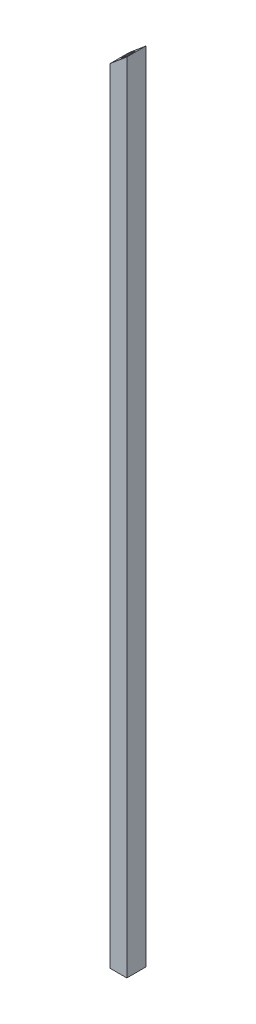
ISO-10303-21;
HEADER;
FILE_DESCRIPTION(('STEP AP214'),'2;1');
FILE_NAME('part.step','',(''),(''),'','','');
FILE_SCHEMA(('AUTOMOTIVE_DESIGN { 1 0 10303 214 1 1 1 1 }'));
ENDSEC;
DATA;
#1=APPLICATION_CONTEXT('core data for automotive mechanical design processes');
#2=APPLICATION_PROTOCOL_DEFINITION('international standard','automotive_design',2000,#1);
#3=PRODUCT_CONTEXT('',#1,'mechanical');
#4=PRODUCT('Part','Part','',(#3));
#5=PRODUCT_RELATED_PRODUCT_CATEGORY('part','',(#4));
#6=PRODUCT_DEFINITION_FORMATION('','',#4);
#7=PRODUCT_DEFINITION_CONTEXT('part definition',#1,'design');
#8=PRODUCT_DEFINITION('design','',#6,#7);
#9=PRODUCT_DEFINITION_SHAPE('','',#8);
#10=(LENGTH_UNIT() NAMED_UNIT(*) SI_UNIT(.MILLI.,.METRE.));
#11=(NAMED_UNIT(*) PLANE_ANGLE_UNIT() SI_UNIT($,.RADIAN.));
#12=(NAMED_UNIT(*) SI_UNIT($,.STERADIAN.) SOLID_ANGLE_UNIT());
#13=UNCERTAINTY_MEASURE_WITH_UNIT(LENGTH_MEASURE(1.E-05),#10,'distance_accuracy_value','');
#14=(GEOMETRIC_REPRESENTATION_CONTEXT(3) GLOBAL_UNCERTAINTY_ASSIGNED_CONTEXT((#13)) GLOBAL_UNIT_ASSIGNED_CONTEXT((#10,
#11,#12)) REPRESENTATION_CONTEXT('',''));
#15=CARTESIAN_POINT('',(0.,0.,0.));
#16=DIRECTION('',(0.,0.,1.));
#17=DIRECTION('',(1.,0.,0.));
#18=AXIS2_PLACEMENT_3D('',#15,#16,#17);
#19=CARTESIAN_POINT('',(11.1125,-533.4,12.7));
#20=DIRECTION('',(-1.,0.,0.));
#21=DIRECTION('',(0.,0.,1.));
#22=AXIS2_PLACEMENT_3D('',#19,#20,#21);
#23=PLANE('',#22);
#24=DIRECTION('',(0.,1.,0.));
#25=VECTOR('',#24,1.);
#26=CARTESIAN_POINT('',(11.1125,-533.4,-12.7));
#27=LINE('',#26,#25);
#28=CARTESIAN_POINT('',(11.1125,-533.4,-12.7));
#29=VERTEX_POINT('',#28);
#30=CARTESIAN_POINT('',(11.1125,533.4,-12.7));
#31=VERTEX_POINT('',#30);
#32=EDGE_CURVE('E119',#29,#31,#27,.T.);
#33=ORIENTED_EDGE('',*,*,#32,.T.);
#34=DIRECTION('',(0.,0.,-1.));
#35=VECTOR('',#34,1.);
#36=CARTESIAN_POINT('',(11.1125,533.4,12.7));
#37=LINE('',#36,#35);
#38=CARTESIAN_POINT('',(11.1125,533.4,12.7));
#39=VERTEX_POINT('',#38);
#40=EDGE_CURVE('E40',#39,#31,#37,.T.);
#41=ORIENTED_EDGE('',*,*,#40,.F.);
#42=DIRECTION('',(0.,1.,0.));
#43=VECTOR('',#42,1.);
#44=CARTESIAN_POINT('',(11.1125,-533.4,12.7));
#45=LINE('',#44,#43);
#46=CARTESIAN_POINT('',(11.1125,-533.4,12.7));
#47=VERTEX_POINT('',#46);
#48=EDGE_CURVE('E121',#47,#39,#45,.T.);
#49=ORIENTED_EDGE('',*,*,#48,.F.);
#50=DIRECTION('',(0.,0.,-1.));
#51=VECTOR('',#50,1.);
#52=CARTESIAN_POINT('',(11.1125,-533.4,12.7));
#53=LINE('',#52,#51);
#54=EDGE_CURVE('E127',#47,#29,#53,.T.);
#55=ORIENTED_EDGE('',*,*,#54,.T.);
#56=EDGE_LOOP('',(#33,#41,#49,#55));
#57=FACE_BOUND('',#56,.T.);
#58=ADVANCED_FACE('F33',(#57),#23,.F.);
#59=CARTESIAN_POINT('',(-11.1125,-533.4,12.7));
#60=DIRECTION('',(1.,0.,0.));
#61=DIRECTION('',(0.,0.,-1.));
#62=AXIS2_PLACEMENT_3D('',#59,#60,#61);
#63=PLANE('',#62);
#64=DIRECTION('',(0.,-1.,0.));
#65=VECTOR('',#64,1.);
#66=CARTESIAN_POINT('',(-11.1125,-533.4,12.7));
#67=LINE('',#66,#65);
#68=CARTESIAN_POINT('',(-11.1125,514.751010697085,12.7));
#69=VERTEX_POINT('',#68);
#70=CARTESIAN_POINT('',(-11.1125,-533.4,12.7));
#71=VERTEX_POINT('',#70);
#72=EDGE_CURVE('E114',#69,#71,#67,.T.);
#73=ORIENTED_EDGE('',*,*,#72,.F.);
#74=DIRECTION('',(0.,0.,1.));
#75=VECTOR('',#74,1.);
#76=CARTESIAN_POINT('',(-11.1125,514.751010697085,-12.7));
#77=LINE('',#76,#75);
#78=CARTESIAN_POINT('',(-11.1125,514.751010697085,-12.7));
#79=VERTEX_POINT('',#78);
#80=EDGE_CURVE('E99',#79,#69,#77,.T.);
#81=ORIENTED_EDGE('',*,*,#80,.F.);
#82=DIRECTION('',(0.,-1.,0.));
#83=VECTOR('',#82,1.);
#84=CARTESIAN_POINT('',(-11.1125,-533.4,-12.7));
#85=LINE('',#84,#83);
#86=CARTESIAN_POINT('',(-11.1125,-533.4,-12.7));
#87=VERTEX_POINT('',#86);
#88=EDGE_CURVE('E112',#79,#87,#85,.T.);
#89=ORIENTED_EDGE('',*,*,#88,.T.);
#90=DIRECTION('',(0.,0.,-1.));
#91=VECTOR('',#90,1.);
#92=CARTESIAN_POINT('',(-11.1125,-533.4,12.7));
#93=LINE('',#92,#91);
#94=EDGE_CURVE('E130',#71,#87,#93,.T.);
#95=ORIENTED_EDGE('',*,*,#94,.F.);
#96=EDGE_LOOP('',(#73,#81,#89,#95));
#97=FACE_BOUND('',#96,.T.);
#98=ADVANCED_FACE('F110',(#97),#63,.F.);
#99=CARTESIAN_POINT('',(-11.1125,-533.4,12.7));
#100=DIRECTION('',(0.,1.,0.));
#101=DIRECTION('',(0.,0.,1.));
#102=AXIS2_PLACEMENT_3D('',#99,#100,#101);
#103=PLANE('',#102);
#104=DIRECTION('',(1.,0.,0.));
#105=VECTOR('',#104,1.);
#106=CARTESIAN_POINT('',(-4.76249999999999,-533.4,6.35));
#107=LINE('',#106,#105);
#108=CARTESIAN_POINT('',(-4.76249999999999,-533.4,6.35));
#109=VERTEX_POINT('',#108);
#110=CARTESIAN_POINT('',(4.7625,-533.4,6.35));
#111=VERTEX_POINT('',#110);
#112=EDGE_CURVE('E146',#109,#111,#107,.T.);
#113=ORIENTED_EDGE('',*,*,#112,.T.);
#114=DIRECTION('',(0.,0.,-1.));
#115=VECTOR('',#114,1.);
#116=CARTESIAN_POINT('',(4.7625,-533.4,6.35));
#117=LINE('',#116,#115);
#118=CARTESIAN_POINT('',(4.7625,-533.4,-6.35));
#119=VERTEX_POINT('',#118);
#120=EDGE_CURVE('E159',#111,#119,#117,.T.);
#121=ORIENTED_EDGE('',*,*,#120,.T.);
#122=DIRECTION('',(-1.,0.,0.));
#123=VECTOR('',#122,1.);
#124=CARTESIAN_POINT('',(4.7625,-533.4,-6.35));
#125=LINE('',#124,#123);
#126=CARTESIAN_POINT('',(-4.76249999999999,-533.4,-6.35));
#127=VERTEX_POINT('',#126);
#128=EDGE_CURVE('E156',#119,#127,#125,.T.);
#129=ORIENTED_EDGE('',*,*,#128,.T.);
#130=DIRECTION('',(0.,0.,1.));
#131=VECTOR('',#130,1.);
#132=CARTESIAN_POINT('',(-4.76249999999999,-533.4,-6.35));
#133=LINE('',#132,#131);
#134=EDGE_CURVE('E54',#127,#109,#133,.T.);
#135=ORIENTED_EDGE('',*,*,#134,.T.);
#136=EDGE_LOOP('',(#113,#121,#129,#135));
#137=FACE_BOUND('',#136,.T.);
#138=DIRECTION('',(1.,0.,0.));
#139=VECTOR('',#138,1.);
#140=CARTESIAN_POINT('',(-11.1125,-533.4,-12.7));
#141=LINE('',#140,#139);
#142=EDGE_CURVE('E118',#87,#29,#141,.T.);
#143=ORIENTED_EDGE('',*,*,#142,.T.);
#144=ORIENTED_EDGE('',*,*,#54,.F.);
#145=DIRECTION('',(1.,0.,0.));
#146=VECTOR('',#145,1.);
#147=CARTESIAN_POINT('',(-11.1125,-533.4,12.7));
#148=LINE('',#147,#146);
#149=EDGE_CURVE('E131',#71,#47,#148,.T.);
#150=ORIENTED_EDGE('',*,*,#149,.F.);
#151=ORIENTED_EDGE('',*,*,#94,.T.);
#152=EDGE_LOOP('',(#143,#144,#150,#151));
#153=FACE_BOUND('',#152,.T.);
#154=ADVANCED_FACE('F134',(#137,#153),#103,.F.);
#155=CARTESIAN_POINT('',(0.,0.,12.7));
#156=DIRECTION('',(0.,0.,-1.));
#157=DIRECTION('',(-1.,0.,0.));
#158=AXIS2_PLACEMENT_3D('',#155,#156,#157);
#159=PLANE('',#158);
#160=ORIENTED_EDGE('',*,*,#48,.T.);
#161=DIRECTION('',(0.766044443118974,0.642787609686544,0.));
#162=VECTOR('',#161,1.);
#163=CARTESIAN_POINT('',(11.1125,533.4,12.7));
#164=LINE('',#163,#162);
#165=EDGE_CURVE('E106',#69,#39,#164,.T.);
#166=ORIENTED_EDGE('',*,*,#165,.F.);
#167=ORIENTED_EDGE('',*,*,#72,.T.);
#168=ORIENTED_EDGE('',*,*,#149,.T.);
#169=EDGE_LOOP('',(#160,#166,#167,#168));
#170=FACE_BOUND('',#169,.T.);
#171=ADVANCED_FACE('F169',(#170),#159,.F.);
#172=CARTESIAN_POINT('',(0.,0.,-12.7));
#173=DIRECTION('',(0.,0.,-1.));
#174=DIRECTION('',(-1.,0.,0.));
#175=AXIS2_PLACEMENT_3D('',#172,#173,#174);
#176=PLANE('',#175);
#177=DIRECTION('',(0.766044443118974,0.642787609686544,0.));
#178=VECTOR('',#177,1.);
#179=CARTESIAN_POINT('',(11.1125,533.4,-12.7));
#180=LINE('',#179,#178);
#181=EDGE_CURVE('E96',#79,#31,#180,.T.);
#182=ORIENTED_EDGE('',*,*,#181,.T.);
#183=ORIENTED_EDGE('',*,*,#32,.F.);
#184=ORIENTED_EDGE('',*,*,#142,.F.);
#185=ORIENTED_EDGE('',*,*,#88,.F.);
#186=EDGE_LOOP('',(#182,#183,#184,#185));
#187=FACE_BOUND('',#186,.T.);
#188=ADVANCED_FACE('F117',(#187),#176,.T.);
#189=CARTESIAN_POINT('',(4.7625,-533.4,6.35));
#190=DIRECTION('',(1.,0.,0.));
#191=DIRECTION('',(0.,0.,-1.));
#192=AXIS2_PLACEMENT_3D('',#189,#190,#191);
#193=PLANE('',#192);
#194=DIRECTION('',(0.,1.,0.));
#195=VECTOR('',#194,1.);
#196=CARTESIAN_POINT('',(4.7625,-533.4,6.35));
#197=LINE('',#196,#195);
#198=CARTESIAN_POINT('',(4.7625,528.071717342024,6.35));
#199=VERTEX_POINT('',#198);
#200=EDGE_CURVE('E123',#111,#199,#197,.T.);
#201=ORIENTED_EDGE('',*,*,#200,.T.);
#202=DIRECTION('',(0.,0.,-1.));
#203=VECTOR('',#202,1.);
#204=CARTESIAN_POINT('',(4.7625,528.071717342024,6.35));
#205=LINE('',#204,#203);
#206=CARTESIAN_POINT('',(4.7625,528.071717342024,-6.35));
#207=VERTEX_POINT('',#206);
#208=EDGE_CURVE('E162',#199,#207,#205,.T.);
#209=ORIENTED_EDGE('',*,*,#208,.T.);
#210=DIRECTION('',(0.,1.,0.));
#211=VECTOR('',#210,1.);
#212=CARTESIAN_POINT('',(4.7625,-533.4,-6.35));
#213=LINE('',#212,#211);
#214=EDGE_CURVE('E142',#119,#207,#213,.T.);
#215=ORIENTED_EDGE('',*,*,#214,.F.);
#216=ORIENTED_EDGE('',*,*,#120,.F.);
#217=EDGE_LOOP('',(#201,#209,#215,#216));
#218=FACE_BOUND('',#217,.T.);
#219=ADVANCED_FACE('F185',(#218),#193,.F.);
#220=CARTESIAN_POINT('',(-4.76249999999999,-533.4,6.35));
#221=DIRECTION('',(0.,0.,1.));
#222=DIRECTION('',(1.,0.,0.));
#223=AXIS2_PLACEMENT_3D('',#220,#221,#222);
#224=PLANE('',#223);
#225=DIRECTION('',(0.,1.,0.));
#226=VECTOR('',#225,1.);
#227=CARTESIAN_POINT('',(-4.76249999999999,-533.4,6.35));
#228=LINE('',#227,#226);
#229=CARTESIAN_POINT('',(-4.76249999999999,520.07929335506,6.35));
#230=VERTEX_POINT('',#229);
#231=EDGE_CURVE('E148',#109,#230,#228,.T.);
#232=ORIENTED_EDGE('',*,*,#231,.T.);
#233=DIRECTION('',(0.766044443118975,0.642787609686544,0.));
#234=VECTOR('',#233,1.);
#235=CARTESIAN_POINT('',(-523.499787866944,84.8070264280003,6.35));
#236=LINE('',#235,#234);
#237=EDGE_CURVE('E165',#230,#199,#236,.T.);
#238=ORIENTED_EDGE('',*,*,#237,.T.);
#239=ORIENTED_EDGE('',*,*,#200,.F.);
#240=ORIENTED_EDGE('',*,*,#112,.F.);
#241=EDGE_LOOP('',(#232,#238,#239,#240));
#242=FACE_BOUND('',#241,.T.);
#243=ADVANCED_FACE('F189',(#242),#224,.F.);
#244=CARTESIAN_POINT('',(-4.76249999999999,-533.4,-6.35));
#245=DIRECTION('',(-1.,0.,0.));
#246=DIRECTION('',(0.,0.,1.));
#247=AXIS2_PLACEMENT_3D('',#244,#245,#246);
#248=PLANE('',#247);
#249=DIRECTION('',(0.,1.,0.));
#250=VECTOR('',#249,1.);
#251=CARTESIAN_POINT('',(-4.76249999999999,-533.4,-6.35));
#252=LINE('',#251,#250);
#253=CARTESIAN_POINT('',(-4.7625,520.07929335506,-6.35));
#254=VERTEX_POINT('',#253);
#255=EDGE_CURVE('E145',#127,#254,#252,.T.);
#256=ORIENTED_EDGE('',*,*,#255,.T.);
#257=DIRECTION('',(0.,0.,1.));
#258=VECTOR('',#257,1.);
#259=CARTESIAN_POINT('',(-4.76249999999999,520.07929335506,-6.35));
#260=LINE('',#259,#258);
#261=EDGE_CURVE('E47',#254,#230,#260,.T.);
#262=ORIENTED_EDGE('',*,*,#261,.T.);
#263=ORIENTED_EDGE('',*,*,#231,.F.);
#264=ORIENTED_EDGE('',*,*,#134,.F.);
#265=EDGE_LOOP('',(#256,#262,#263,#264));
#266=FACE_BOUND('',#265,.T.);
#267=ADVANCED_FACE('F194',(#266),#248,.F.);
#268=CARTESIAN_POINT('',(4.7625,-533.4,-6.35));
#269=DIRECTION('',(0.,0.,-1.));
#270=DIRECTION('',(-1.,0.,0.));
#271=AXIS2_PLACEMENT_3D('',#268,#269,#270);
#272=PLANE('',#271);
#273=ORIENTED_EDGE('',*,*,#214,.T.);
#274=DIRECTION('',(-0.766044443118975,-0.642787609686544,0.));
#275=VECTOR('',#274,1.);
#276=CARTESIAN_POINT('',(-517.910288420805,89.4971733517209,-6.35));
#277=LINE('',#276,#275);
#278=EDGE_CURVE('E11',#207,#254,#277,.T.);
#279=ORIENTED_EDGE('',*,*,#278,.T.);
#280=ORIENTED_EDGE('',*,*,#255,.F.);
#281=ORIENTED_EDGE('',*,*,#128,.F.);
#282=EDGE_LOOP('',(#273,#279,#280,#281));
#283=FACE_BOUND('',#282,.T.);
#284=ADVANCED_FACE('F191',(#283),#272,.F.);
#285=CARTESIAN_POINT('',(11.1125,533.4,-12.7));
#286=DIRECTION('',(0.642787609686544,-0.766044443118974,0.));
#287=DIRECTION('',(0.766044443118975,0.642787609686544,0.));
#288=AXIS2_PLACEMENT_3D('',#285,#286,#287);
#289=PLANE('',#288);
#290=ORIENTED_EDGE('',*,*,#165,.T.);
#291=ORIENTED_EDGE('',*,*,#40,.T.);
#292=ORIENTED_EDGE('',*,*,#181,.F.);
#293=ORIENTED_EDGE('',*,*,#80,.T.);
#294=EDGE_LOOP('',(#290,#291,#292,#293));
#295=FACE_BOUND('',#294,.T.);
#296=ORIENTED_EDGE('',*,*,#237,.F.);
#297=ORIENTED_EDGE('',*,*,#261,.F.);
#298=ORIENTED_EDGE('',*,*,#278,.F.);
#299=ORIENTED_EDGE('',*,*,#208,.F.);
#300=EDGE_LOOP('',(#296,#297,#298,#299));
#301=FACE_BOUND('',#300,.T.);
#302=ADVANCED_FACE('F98',(#295,#301),#289,.F.);
#303=CLOSED_SHELL('',(#58,#98,#154,#171,#188,#219,#243,#267,#284,#302));
#304=MANIFOLD_SOLID_BREP('B2',#303);
#305=ADVANCED_BREP_SHAPE_REPRESENTATION('',(#18,#304),#14);
#306=SHAPE_DEFINITION_REPRESENTATION(#9,#305);
ENDSEC;
END-ISO-10303-21;
